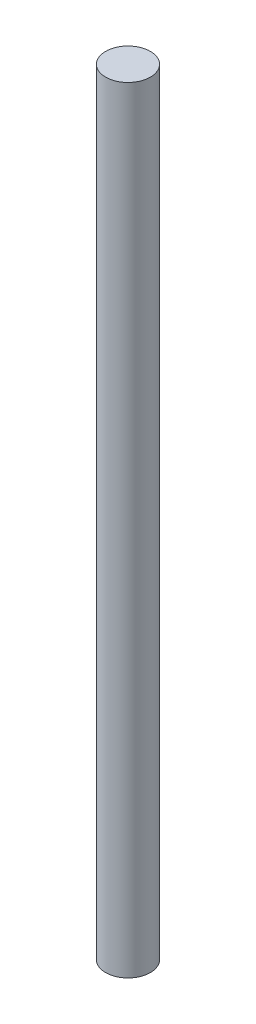
ISO-10303-21;
HEADER;
FILE_DESCRIPTION(('STEP AP214'),'2;1');
FILE_NAME('part.step','',(''),(''),'','','');
FILE_SCHEMA(('AUTOMOTIVE_DESIGN { 1 0 10303 214 1 1 1 1 }'));
ENDSEC;
DATA;
#1=APPLICATION_CONTEXT('core data for automotive mechanical design processes');
#2=APPLICATION_PROTOCOL_DEFINITION('international standard','automotive_design',2000,#1);
#3=PRODUCT_CONTEXT('',#1,'mechanical');
#4=PRODUCT('Part','Part','',(#3));
#5=PRODUCT_RELATED_PRODUCT_CATEGORY('part','',(#4));
#6=PRODUCT_DEFINITION_FORMATION('','',#4);
#7=PRODUCT_DEFINITION_CONTEXT('part definition',#1,'design');
#8=PRODUCT_DEFINITION('design','',#6,#7);
#9=PRODUCT_DEFINITION_SHAPE('','',#8);
#10=(LENGTH_UNIT() NAMED_UNIT(*) SI_UNIT(.MILLI.,.METRE.));
#11=(NAMED_UNIT(*) PLANE_ANGLE_UNIT() SI_UNIT($,.RADIAN.));
#12=(NAMED_UNIT(*) SI_UNIT($,.STERADIAN.) SOLID_ANGLE_UNIT());
#13=UNCERTAINTY_MEASURE_WITH_UNIT(LENGTH_MEASURE(1.E-05),#10,'distance_accuracy_value','');
#14=(GEOMETRIC_REPRESENTATION_CONTEXT(3) GLOBAL_UNCERTAINTY_ASSIGNED_CONTEXT((#13)) GLOBAL_UNIT_ASSIGNED_CONTEXT((#10,
#11,#12)) REPRESENTATION_CONTEXT('',''));
#15=CARTESIAN_POINT('',(0.,0.,0.));
#16=DIRECTION('',(0.,0.,1.));
#17=DIRECTION('',(1.,0.,0.));
#18=AXIS2_PLACEMENT_3D('',#15,#16,#17);
#19=CARTESIAN_POINT('',(0.,-61.2565,0.));
#20=DIRECTION('',(0.,1.,0.));
#21=DIRECTION('',(0.,0.,1.));
#22=AXIS2_PLACEMENT_3D('',#19,#20,#21);
#23=PLANE('',#22);
#24=CARTESIAN_POINT('',(0.,-61.2565,0.));
#25=DIRECTION('',(0.,1.,0.));
#26=DIRECTION('',(-1.,0.,0.));
#27=AXIS2_PLACEMENT_3D('',#24,#25,#26);
#28=CIRCLE('',#27,4.22650000000002);
#29=CARTESIAN_POINT('',(-4.22650000000002,-61.2565,0.));
#30=VERTEX_POINT('',#29);
#31=EDGE_CURVE('E10',#30,#30,#28,.T.);
#32=ORIENTED_EDGE('',*,*,#31,.F.);
#33=EDGE_LOOP('',(#32));
#34=FACE_BOUND('',#33,.T.);
#35=ADVANCED_FACE('F39',(#34),#23,.F.);
#36=CARTESIAN_POINT('',(0.,24.7675773883248,0.));
#37=DIRECTION('',(0.,1.,0.));
#38=DIRECTION('',(-1.,0.,0.));
#39=AXIS2_PLACEMENT_3D('',#36,#37,#38);
#40=CYLINDRICAL_SURFACE('',#39,4.22650000000002);
#41=CARTESIAN_POINT('',(0.,85.3955,0.));
#42=DIRECTION('',(0.,1.,0.));
#43=DIRECTION('',(-1.,0.,0.));
#44=AXIS2_PLACEMENT_3D('',#41,#42,#43);
#45=CIRCLE('',#44,4.22650000000002);
#46=CARTESIAN_POINT('',(-4.22650000000002,85.3955,0.));
#47=VERTEX_POINT('',#46);
#48=EDGE_CURVE('E43',#47,#47,#45,.T.);
#49=ORIENTED_EDGE('',*,*,#48,.F.);
#50=EDGE_LOOP('',(#49));
#51=FACE_BOUND('',#50,.T.);
#52=ORIENTED_EDGE('',*,*,#31,.T.);
#53=EDGE_LOOP('',(#52));
#54=FACE_BOUND('',#53,.T.);
#55=ADVANCED_FACE('F53',(#51,#54),#40,.T.);
#56=CARTESIAN_POINT('',(0.,85.3955,0.));
#57=DIRECTION('',(0.,1.,0.));
#58=DIRECTION('',(0.,0.,1.));
#59=AXIS2_PLACEMENT_3D('',#56,#57,#58);
#60=PLANE('',#59);
#61=ORIENTED_EDGE('',*,*,#48,.T.);
#62=EDGE_LOOP('',(#61));
#63=FACE_BOUND('',#62,.T.);
#64=ADVANCED_FACE('F41',(#63),#60,.T.);
#65=CLOSED_SHELL('',(#35,#55,#64));
#66=MANIFOLD_SOLID_BREP('B2',#65);
#67=ADVANCED_BREP_SHAPE_REPRESENTATION('',(#18,#66),#14);
#68=SHAPE_DEFINITION_REPRESENTATION(#9,#67);
ENDSEC;
END-ISO-10303-21;
